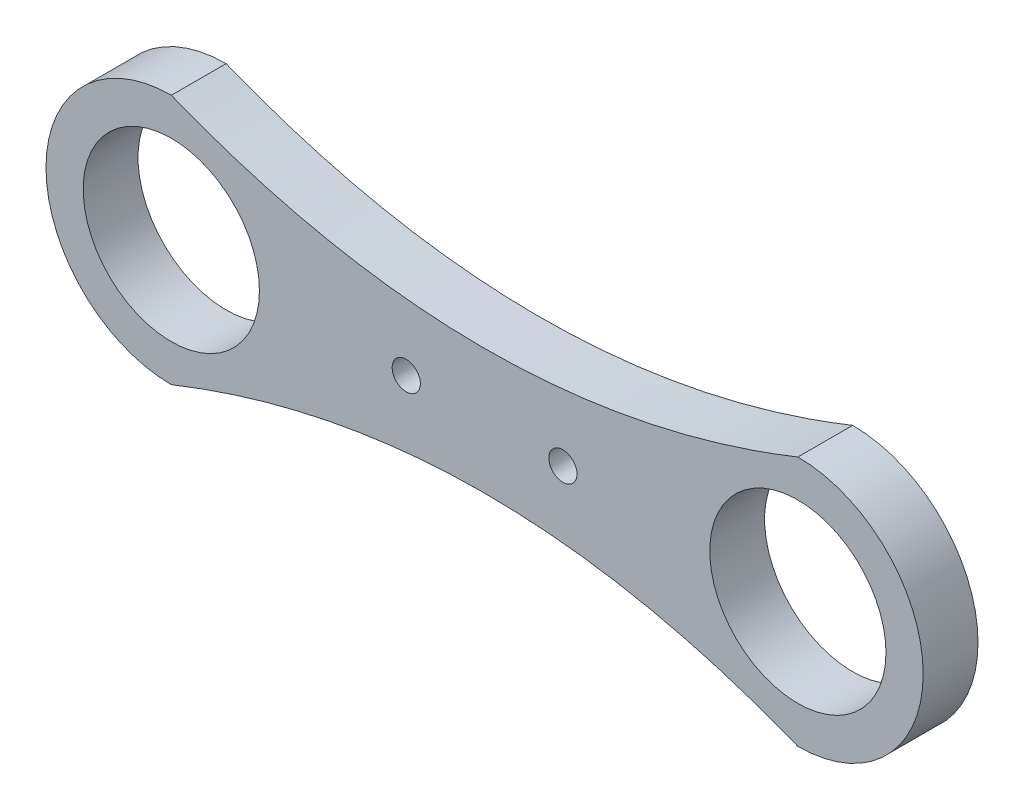
ISO-10303-21;
HEADER;
FILE_DESCRIPTION(('STEP AP214'),'2;1');
FILE_NAME('part.step','',(''),(''),'','','');
FILE_SCHEMA(('AUTOMOTIVE_DESIGN { 1 0 10303 214 1 1 1 1 }'));
ENDSEC;
DATA;
#1=APPLICATION_CONTEXT('core data for automotive mechanical design processes');
#2=APPLICATION_PROTOCOL_DEFINITION('international standard','automotive_design',2000,#1);
#3=PRODUCT_CONTEXT('',#1,'mechanical');
#4=PRODUCT('Part','Part','',(#3));
#5=PRODUCT_RELATED_PRODUCT_CATEGORY('part','',(#4));
#6=PRODUCT_DEFINITION_FORMATION('','',#4);
#7=PRODUCT_DEFINITION_CONTEXT('part definition',#1,'design');
#8=PRODUCT_DEFINITION('design','',#6,#7);
#9=PRODUCT_DEFINITION_SHAPE('','',#8);
#10=(LENGTH_UNIT() NAMED_UNIT(*) SI_UNIT(.MILLI.,.METRE.));
#11=(NAMED_UNIT(*) PLANE_ANGLE_UNIT() SI_UNIT($,.RADIAN.));
#12=(NAMED_UNIT(*) SI_UNIT($,.STERADIAN.) SOLID_ANGLE_UNIT());
#13=UNCERTAINTY_MEASURE_WITH_UNIT(LENGTH_MEASURE(1.E-05),#10,'distance_accuracy_value','');
#14=(GEOMETRIC_REPRESENTATION_CONTEXT(3) GLOBAL_UNCERTAINTY_ASSIGNED_CONTEXT((#13)) GLOBAL_UNIT_ASSIGNED_CONTEXT((#10,
#11,#12)) REPRESENTATION_CONTEXT('',''));
#15=CARTESIAN_POINT('',(0.,0.,0.));
#16=DIRECTION('',(0.,0.,1.));
#17=DIRECTION('',(1.,0.,0.));
#18=AXIS2_PLACEMENT_3D('',#15,#16,#17);
#19=CARTESIAN_POINT('',(0.,0.,7.));
#20=DIRECTION('',(0.,0.,-1.));
#21=DIRECTION('',(-1.,0.,0.));
#22=AXIS2_PLACEMENT_3D('',#19,#20,#21);
#23=CYLINDRICAL_SURFACE('',#22,16.);
#24=CARTESIAN_POINT('',(0.,0.,0.));
#25=DIRECTION('',(0.,0.,1.));
#26=DIRECTION('',(1.,0.,0.));
#27=AXIS2_PLACEMENT_3D('',#24,#25,#26);
#28=CIRCLE('',#27,16.);
#29=CARTESIAN_POINT('',(0.,16.,0.));
#30=VERTEX_POINT('',#29);
#31=CARTESIAN_POINT('',(0.,-16.,0.));
#32=VERTEX_POINT('',#31);
#33=EDGE_CURVE('E156',#30,#32,#28,.T.);
#34=ORIENTED_EDGE('',*,*,#33,.T.);
#35=DIRECTION('',(0.,0.,-1.));
#36=VECTOR('',#35,1.);
#37=CARTESIAN_POINT('',(0.,-16.,7.));
#38=LINE('',#37,#36);
#39=CARTESIAN_POINT('',(0.,-16.,7.));
#40=VERTEX_POINT('',#39);
#41=EDGE_CURVE('E11',#40,#32,#38,.T.);
#42=ORIENTED_EDGE('',*,*,#41,.F.);
#43=CARTESIAN_POINT('',(0.,0.,7.));
#44=DIRECTION('',(0.,0.,1.));
#45=DIRECTION('',(1.,0.,0.));
#46=AXIS2_PLACEMENT_3D('',#43,#44,#45);
#47=CIRCLE('',#46,16.);
#48=CARTESIAN_POINT('',(0.,16.,7.));
#49=VERTEX_POINT('',#48);
#50=EDGE_CURVE('E98',#49,#40,#47,.T.);
#51=ORIENTED_EDGE('',*,*,#50,.F.);
#52=DIRECTION('',(0.,0.,-1.));
#53=VECTOR('',#52,1.);
#54=CARTESIAN_POINT('',(0.,16.,7.));
#55=LINE('',#54,#53);
#56=EDGE_CURVE('E65',#49,#30,#55,.T.);
#57=ORIENTED_EDGE('',*,*,#56,.T.);
#58=EDGE_LOOP('',(#34,#42,#51,#57));
#59=FACE_BOUND('',#58,.T.);
#60=ADVANCED_FACE('F45',(#59),#23,.T.);
#61=CARTESIAN_POINT('',(0.,-16.,7.));
#62=CARTESIAN_POINT('',(40.,0.,7.));
#63=CARTESIAN_POINT('',(80.,-16.,7.));
#64=B_SPLINE_CURVE_WITH_KNOTS('',2,(#61,#62,#63),.UNSPECIFIED.,.F.,.F.,(3,3),(0.,1.),.UNSPECIFIED.);
#65=DIRECTION('',(0.,0.,-1.));
#66=VECTOR('',#65,1.);
#67=SURFACE_OF_LINEAR_EXTRUSION('',#64,#66);
#68=CARTESIAN_POINT('',(0.,-16.,0.));
#69=CARTESIAN_POINT('',(40.,0.,0.));
#70=CARTESIAN_POINT('',(80.,-16.,0.));
#71=B_SPLINE_CURVE_WITH_KNOTS('',2,(#68,#69,#70),.UNSPECIFIED.,.F.,.F.,(3,3),(0.,1.),.UNSPECIFIED.);
#72=CARTESIAN_POINT('',(80.,-16.,0.));
#73=VERTEX_POINT('',#72);
#74=EDGE_CURVE('E104',#32,#73,#71,.T.);
#75=ORIENTED_EDGE('',*,*,#74,.T.);
#76=DIRECTION('',(0.,0.,-1.));
#77=VECTOR('',#76,1.);
#78=CARTESIAN_POINT('',(80.,-16.,7.));
#79=LINE('',#78,#77);
#80=CARTESIAN_POINT('',(80.,-16.,7.));
#81=VERTEX_POINT('',#80);
#82=EDGE_CURVE('E56',#81,#73,#79,.T.);
#83=ORIENTED_EDGE('',*,*,#82,.F.);
#84=EDGE_CURVE('E91',#40,#81,#64,.T.);
#85=ORIENTED_EDGE('',*,*,#84,.F.);
#86=ORIENTED_EDGE('',*,*,#41,.T.);
#87=EDGE_LOOP('',(#75,#83,#85,#86));
#88=FACE_BOUND('',#87,.T.);
#89=ADVANCED_FACE('F103',(#88),#67,.F.);
#90=CARTESIAN_POINT('',(80.,0.,7.));
#91=DIRECTION('',(0.,0.,-1.));
#92=DIRECTION('',(-1.,0.,0.));
#93=AXIS2_PLACEMENT_3D('',#90,#91,#92);
#94=CYLINDRICAL_SURFACE('',#93,16.);
#95=CARTESIAN_POINT('',(80.,0.,0.));
#96=DIRECTION('',(0.,0.,1.));
#97=DIRECTION('',(1.,0.,0.));
#98=AXIS2_PLACEMENT_3D('',#95,#96,#97);
#99=CIRCLE('',#98,16.);
#100=CARTESIAN_POINT('',(80.,16.,0.));
#101=VERTEX_POINT('',#100);
#102=EDGE_CURVE('E166',#73,#101,#99,.T.);
#103=ORIENTED_EDGE('',*,*,#102,.T.);
#104=DIRECTION('',(0.,0.,-1.));
#105=VECTOR('',#104,1.);
#106=CARTESIAN_POINT('',(80.,16.,7.));
#107=LINE('',#106,#105);
#108=CARTESIAN_POINT('',(80.,16.,7.));
#109=VERTEX_POINT('',#108);
#110=EDGE_CURVE('E80',#109,#101,#107,.T.);
#111=ORIENTED_EDGE('',*,*,#110,.F.);
#112=CARTESIAN_POINT('',(80.,0.,7.));
#113=DIRECTION('',(0.,0.,1.));
#114=DIRECTION('',(1.,0.,0.));
#115=AXIS2_PLACEMENT_3D('',#112,#113,#114);
#116=CIRCLE('',#115,16.);
#117=EDGE_CURVE('E97',#81,#109,#116,.T.);
#118=ORIENTED_EDGE('',*,*,#117,.F.);
#119=ORIENTED_EDGE('',*,*,#82,.T.);
#120=EDGE_LOOP('',(#103,#111,#118,#119));
#121=FACE_BOUND('',#120,.T.);
#122=ADVANCED_FACE('F109',(#121),#94,.T.);
#123=CARTESIAN_POINT('',(0.,0.,7.));
#124=DIRECTION('',(0.,0.,-1.));
#125=DIRECTION('',(-1.,0.,0.));
#126=AXIS2_PLACEMENT_3D('',#123,#124,#125);
#127=CYLINDRICAL_SURFACE('',#126,11.25);
#128=CARTESIAN_POINT('',(0.,0.,7.));
#129=DIRECTION('',(0.,0.,1.));
#130=DIRECTION('',(1.,0.,0.));
#131=AXIS2_PLACEMENT_3D('',#128,#129,#130);
#132=CIRCLE('',#131,11.25);
#133=CARTESIAN_POINT('',(11.25,0.,7.));
#134=VERTEX_POINT('',#133);
#135=EDGE_CURVE('E150',#134,#134,#132,.T.);
#136=ORIENTED_EDGE('',*,*,#135,.T.);
#137=EDGE_LOOP('',(#136));
#138=FACE_BOUND('',#137,.T.);
#139=CARTESIAN_POINT('',(0.,0.,0.));
#140=DIRECTION('',(0.,0.,1.));
#141=DIRECTION('',(1.,0.,0.));
#142=AXIS2_PLACEMENT_3D('',#139,#140,#141);
#143=CIRCLE('',#142,11.25);
#144=CARTESIAN_POINT('',(11.25,0.,0.));
#145=VERTEX_POINT('',#144);
#146=EDGE_CURVE('E153',#145,#145,#143,.T.);
#147=ORIENTED_EDGE('',*,*,#146,.F.);
#148=EDGE_LOOP('',(#147));
#149=FACE_BOUND('',#148,.T.);
#150=ADVANCED_FACE('F137',(#138,#149),#127,.F.);
#151=CARTESIAN_POINT('',(80.,0.,7.));
#152=DIRECTION('',(0.,0.,-1.));
#153=DIRECTION('',(-1.,0.,0.));
#154=AXIS2_PLACEMENT_3D('',#151,#152,#153);
#155=CYLINDRICAL_SURFACE('',#154,11.25);
#156=CARTESIAN_POINT('',(80.,0.,7.));
#157=DIRECTION('',(0.,0.,1.));
#158=DIRECTION('',(1.,0.,0.));
#159=AXIS2_PLACEMENT_3D('',#156,#157,#158);
#160=CIRCLE('',#159,11.25);
#161=CARTESIAN_POINT('',(91.25,0.,7.));
#162=VERTEX_POINT('',#161);
#163=EDGE_CURVE('E178',#162,#162,#160,.T.);
#164=ORIENTED_EDGE('',*,*,#163,.T.);
#165=EDGE_LOOP('',(#164));
#166=FACE_BOUND('',#165,.T.);
#167=CARTESIAN_POINT('',(80.,0.,0.));
#168=DIRECTION('',(0.,0.,1.));
#169=DIRECTION('',(1.,0.,0.));
#170=AXIS2_PLACEMENT_3D('',#167,#168,#169);
#171=CIRCLE('',#170,11.25);
#172=CARTESIAN_POINT('',(91.25,0.,0.));
#173=VERTEX_POINT('',#172);
#174=EDGE_CURVE('E123',#173,#173,#171,.T.);
#175=ORIENTED_EDGE('',*,*,#174,.F.);
#176=EDGE_LOOP('',(#175));
#177=FACE_BOUND('',#176,.T.);
#178=ADVANCED_FACE('F47',(#166,#177),#155,.F.);
#179=CARTESIAN_POINT('',(0.,16.,7.));
#180=CARTESIAN_POINT('',(40.,0.,7.));
#181=CARTESIAN_POINT('',(80.,16.,7.));
#182=B_SPLINE_CURVE_WITH_KNOTS('',2,(#179,#180,#181),.UNSPECIFIED.,.F.,.F.,(3,3),(0.,1.),.UNSPECIFIED.);
#183=DIRECTION('',(0.,0.,-1.));
#184=VECTOR('',#183,1.);
#185=SURFACE_OF_LINEAR_EXTRUSION('',#182,#184);
#186=CARTESIAN_POINT('',(0.,16.,0.));
#187=CARTESIAN_POINT('',(40.,0.,0.));
#188=CARTESIAN_POINT('',(80.,16.,0.));
#189=B_SPLINE_CURVE_WITH_KNOTS('',2,(#186,#187,#188),.UNSPECIFIED.,.F.,.F.,(3,3),(0.,1.),.UNSPECIFIED.);
#190=EDGE_CURVE('E172',#30,#101,#189,.T.);
#191=ORIENTED_EDGE('',*,*,#190,.F.);
#192=ORIENTED_EDGE('',*,*,#56,.F.);
#193=EDGE_CURVE('E111',#49,#109,#182,.T.);
#194=ORIENTED_EDGE('',*,*,#193,.T.);
#195=ORIENTED_EDGE('',*,*,#110,.T.);
#196=EDGE_LOOP('',(#191,#192,#194,#195));
#197=FACE_BOUND('',#196,.T.);
#198=ADVANCED_FACE('F129',(#197),#185,.T.);
#199=CARTESIAN_POINT('',(0.,0.,7.));
#200=DIRECTION('',(0.,0.,1.));
#201=DIRECTION('',(1.,0.,0.));
#202=AXIS2_PLACEMENT_3D('',#199,#200,#201);
#203=PLANE('',#202);
#204=CARTESIAN_POINT('',(30.,0.,7.));
#205=DIRECTION('',(0.,0.,1.));
#206=DIRECTION('',(1.,0.,0.));
#207=AXIS2_PLACEMENT_3D('',#204,#205,#206);
#208=CIRCLE('',#207,1.8);
#209=CARTESIAN_POINT('',(31.8,0.,7.));
#210=VERTEX_POINT('',#209);
#211=EDGE_CURVE('E188',#210,#210,#208,.T.);
#212=ORIENTED_EDGE('',*,*,#211,.F.);
#213=EDGE_LOOP('',(#212));
#214=FACE_BOUND('',#213,.T.);
#215=CARTESIAN_POINT('',(50.,0.,7.));
#216=DIRECTION('',(0.,0.,1.));
#217=DIRECTION('',(1.,0.,0.));
#218=AXIS2_PLACEMENT_3D('',#215,#216,#217);
#219=CIRCLE('',#218,1.8);
#220=CARTESIAN_POINT('',(51.8,0.,7.));
#221=VERTEX_POINT('',#220);
#222=EDGE_CURVE('E195',#221,#221,#219,.T.);
#223=ORIENTED_EDGE('',*,*,#222,.F.);
#224=EDGE_LOOP('',(#223));
#225=FACE_BOUND('',#224,.T.);
#226=ORIENTED_EDGE('',*,*,#163,.F.);
#227=EDGE_LOOP('',(#226));
#228=FACE_BOUND('',#227,.T.);
#229=ORIENTED_EDGE('',*,*,#135,.F.);
#230=EDGE_LOOP('',(#229));
#231=FACE_BOUND('',#230,.T.);
#232=ORIENTED_EDGE('',*,*,#50,.T.);
#233=ORIENTED_EDGE('',*,*,#84,.T.);
#234=ORIENTED_EDGE('',*,*,#117,.T.);
#235=ORIENTED_EDGE('',*,*,#193,.F.);
#236=EDGE_LOOP('',(#232,#233,#234,#235));
#237=FACE_BOUND('',#236,.T.);
#238=ADVANCED_FACE('F94',(#214,#225,#228,#231,#237),#203,.T.);
#239=CARTESIAN_POINT('',(0.,0.,0.));
#240=DIRECTION('',(0.,0.,1.));
#241=DIRECTION('',(1.,0.,0.));
#242=AXIS2_PLACEMENT_3D('',#239,#240,#241);
#243=PLANE('',#242);
#244=CARTESIAN_POINT('',(30.,0.,0.));
#245=DIRECTION('',(0.,0.,1.));
#246=DIRECTION('',(1.,0.,0.));
#247=AXIS2_PLACEMENT_3D('',#244,#245,#246);
#248=CIRCLE('',#247,1.8);
#249=CARTESIAN_POINT('',(31.8,0.,0.));
#250=VERTEX_POINT('',#249);
#251=EDGE_CURVE('E49',#250,#250,#248,.T.);
#252=ORIENTED_EDGE('',*,*,#251,.T.);
#253=EDGE_LOOP('',(#252));
#254=FACE_BOUND('',#253,.T.);
#255=CARTESIAN_POINT('',(50.,0.,0.));
#256=DIRECTION('',(0.,0.,1.));
#257=DIRECTION('',(1.,0.,0.));
#258=AXIS2_PLACEMENT_3D('',#255,#256,#257);
#259=CIRCLE('',#258,1.8);
#260=CARTESIAN_POINT('',(51.8,0.,0.));
#261=VERTEX_POINT('',#260);
#262=EDGE_CURVE('E185',#261,#261,#259,.T.);
#263=ORIENTED_EDGE('',*,*,#262,.T.);
#264=EDGE_LOOP('',(#263));
#265=FACE_BOUND('',#264,.T.);
#266=ORIENTED_EDGE('',*,*,#174,.T.);
#267=EDGE_LOOP('',(#266));
#268=FACE_BOUND('',#267,.T.);
#269=ORIENTED_EDGE('',*,*,#146,.T.);
#270=EDGE_LOOP('',(#269));
#271=FACE_BOUND('',#270,.T.);
#272=ORIENTED_EDGE('',*,*,#33,.F.);
#273=ORIENTED_EDGE('',*,*,#190,.T.);
#274=ORIENTED_EDGE('',*,*,#102,.F.);
#275=ORIENTED_EDGE('',*,*,#74,.F.);
#276=EDGE_LOOP('',(#272,#273,#274,#275));
#277=FACE_BOUND('',#276,.T.);
#278=ADVANCED_FACE('F133',(#254,#265,#268,#271,#277),#243,.F.);
#279=CARTESIAN_POINT('',(50.,0.,-3.));
#280=DIRECTION('',(0.,0.,1.));
#281=DIRECTION('',(1.,0.,0.));
#282=AXIS2_PLACEMENT_3D('',#279,#280,#281);
#283=CYLINDRICAL_SURFACE('',#282,1.8);
#284=ORIENTED_EDGE('',*,*,#222,.T.);
#285=EDGE_LOOP('',(#284));
#286=FACE_BOUND('',#285,.T.);
#287=ORIENTED_EDGE('',*,*,#262,.F.);
#288=EDGE_LOOP('',(#287));
#289=FACE_BOUND('',#288,.T.);
#290=ADVANCED_FACE('F217',(#286,#289),#283,.F.);
#291=CARTESIAN_POINT('',(30.,0.,-3.));
#292=DIRECTION('',(0.,0.,1.));
#293=DIRECTION('',(1.,0.,0.));
#294=AXIS2_PLACEMENT_3D('',#291,#292,#293);
#295=CYLINDRICAL_SURFACE('',#294,1.8);
#296=ORIENTED_EDGE('',*,*,#211,.T.);
#297=EDGE_LOOP('',(#296));
#298=FACE_BOUND('',#297,.T.);
#299=ORIENTED_EDGE('',*,*,#251,.F.);
#300=EDGE_LOOP('',(#299));
#301=FACE_BOUND('',#300,.T.);
#302=ADVANCED_FACE('F223',(#298,#301),#295,.F.);
#303=CLOSED_SHELL('',(#60,#89,#122,#150,#178,#198,#238,#278,#290,#302));
#304=MANIFOLD_SOLID_BREP('B2',#303);
#305=ADVANCED_BREP_SHAPE_REPRESENTATION('',(#18,#304),#14);
#306=SHAPE_DEFINITION_REPRESENTATION(#9,#305);
ENDSEC;
END-ISO-10303-21;
